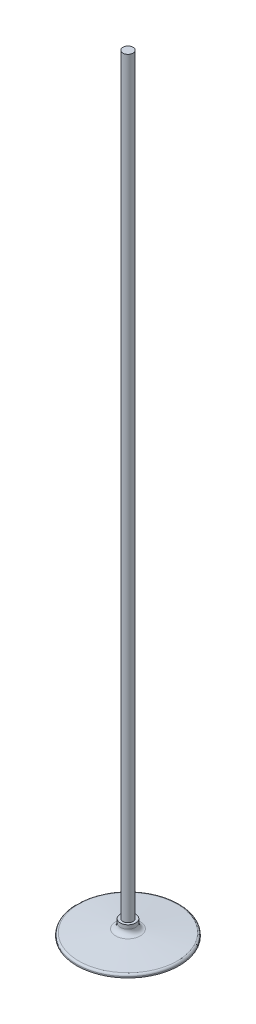
ISO-10303-21;
HEADER;
FILE_DESCRIPTION(('STEP AP214'),'2;1');
FILE_NAME('part.step','',(''),(''),'','','');
FILE_SCHEMA(('AUTOMOTIVE_DESIGN { 1 0 10303 214 1 1 1 1 }'));
ENDSEC;
DATA;
#1=APPLICATION_CONTEXT('core data for automotive mechanical design processes');
#2=APPLICATION_PROTOCOL_DEFINITION('international standard','automotive_design',2000,#1);
#3=PRODUCT_CONTEXT('',#1,'mechanical');
#4=PRODUCT('Part','Part','',(#3));
#5=PRODUCT_RELATED_PRODUCT_CATEGORY('part','',(#4));
#6=PRODUCT_DEFINITION_FORMATION('','',#4);
#7=PRODUCT_DEFINITION_CONTEXT('part definition',#1,'design');
#8=PRODUCT_DEFINITION('design','',#6,#7);
#9=PRODUCT_DEFINITION_SHAPE('','',#8);
#10=(LENGTH_UNIT() NAMED_UNIT(*) SI_UNIT(.MILLI.,.METRE.));
#11=(NAMED_UNIT(*) PLANE_ANGLE_UNIT() SI_UNIT($,.RADIAN.));
#12=(NAMED_UNIT(*) SI_UNIT($,.STERADIAN.) SOLID_ANGLE_UNIT());
#13=UNCERTAINTY_MEASURE_WITH_UNIT(LENGTH_MEASURE(1.E-05),#10,'distance_accuracy_value','');
#14=(GEOMETRIC_REPRESENTATION_CONTEXT(3) GLOBAL_UNCERTAINTY_ASSIGNED_CONTEXT((#13)) GLOBAL_UNIT_ASSIGNED_CONTEXT((#10,
#11,#12)) REPRESENTATION_CONTEXT('',''));
#15=CARTESIAN_POINT('',(0.,0.,0.));
#16=DIRECTION('',(0.,0.,1.));
#17=DIRECTION('',(1.,0.,0.));
#18=AXIS2_PLACEMENT_3D('',#15,#16,#17);
#19=CARTESIAN_POINT('',(0.,0.,0.));
#20=DIRECTION('',(0.,-1.,0.));
#21=DIRECTION('',(0.,0.,-1.));
#22=AXIS2_PLACEMENT_3D('',#19,#20,#21);
#23=PLANE('',#22);
#24=CARTESIAN_POINT('',(0.,0.,0.));
#25=DIRECTION('',(0.,1.,0.));
#26=DIRECTION('',(0.,0.,1.));
#27=AXIS2_PLACEMENT_3D('',#24,#25,#26);
#28=CIRCLE('',#27,100.);
#29=CARTESIAN_POINT('',(0.,0.,100.));
#30=VERTEX_POINT('',#29);
#31=EDGE_CURVE('E52',#30,#30,#28,.T.);
#32=ORIENTED_EDGE('',*,*,#31,.F.);
#33=EDGE_LOOP('',(#32));
#34=FACE_BOUND('',#33,.T.);
#35=ADVANCED_FACE('F32',(#34),#23,.T.);
#36=CARTESIAN_POINT('',(0.,0.,0.));
#37=DIRECTION('',(0.,1.,0.));
#38=DIRECTION('',(0.,0.,1.));
#39=AXIS2_PLACEMENT_3D('',#36,#37,#38);
#40=CYLINDRICAL_SURFACE('',#39,100.);
#41=CARTESIAN_POINT('',(0.,2.33467530393027,0.));
#42=DIRECTION('',(0.,-1.,0.));
#43=DIRECTION('',(0.,0.,-1.));
#44=AXIS2_PLACEMENT_3D('',#41,#42,#43);
#45=CIRCLE('',#44,100.);
#46=CARTESIAN_POINT('',(0.,2.33467530393027,-100.));
#47=VERTEX_POINT('',#46);
#48=EDGE_CURVE('E43',#47,#47,#45,.T.);
#49=ORIENTED_EDGE('',*,*,#48,.T.);
#50=EDGE_LOOP('',(#49));
#51=FACE_BOUND('',#50,.T.);
#52=ORIENTED_EDGE('',*,*,#31,.T.);
#53=EDGE_LOOP('',(#52));
#54=FACE_BOUND('',#53,.T.);
#55=ADVANCED_FACE('F82',(#51,#54),#40,.T.);
#56=CARTESIAN_POINT('',(0.,13.436536399703,0.));
#57=DIRECTION('',(0.,-1.,0.));
#58=DIRECTION('',(0.,0.,-1.));
#59=AXIS2_PLACEMENT_3D('',#56,#57,#58);
#60=CONICAL_SURFACE('',#59,15.,1.48352986419519);
#61=CARTESIAN_POINT('',(0.,12.6379011589597,0.));
#62=DIRECTION('',(0.,-1.,0.));
#63=DIRECTION('',(0.,0.,-1.));
#64=AXIS2_PLACEMENT_3D('',#61,#62,#63);
#65=CIRCLE('',#64,24.1284425725235);
#66=CARTESIAN_POINT('',(0.,12.6379011589597,-24.1284425725242));
#67=VERTEX_POINT('',#66);
#68=EDGE_CURVE('E10',#67,#67,#65,.T.);
#69=CARTESIAN_POINT('',(0.,6.31945409629725,0.));
#70=DIRECTION('',(0.,1.,0.));
#71=DIRECTION('',(0.,0.,1.));
#72=AXIS2_PLACEMENT_3D('',#69,#70,#71);
#73=CIRCLE('',#72,96.3486229709906);
#74=CARTESIAN_POINT('',(0.,6.31945409629725,-96.3486229709906));
#75=VERTEX_POINT('',#74);
#76=EDGE_CURVE('E47',#75,#75,#73,.T.);
#77=CARTESIAN_POINT('',(0.,12.6379011589597,-24.1284425725242));
#78=CARTESIAN_POINT('',(0.,12.572084002057,-24.8807361183415));
#79=CARTESIAN_POINT('',(0.,12.5062668451543,-25.6330296641589));
#80=CARTESIAN_POINT('',(0.,12.3746325313488,-27.1376167557936));
#81=CARTESIAN_POINT('',(0.,12.3088153744461,-27.889910301611));
#82=CARTESIAN_POINT('',(0.,12.1771810606406,-29.3944973932457));
#83=CARTESIAN_POINT('',(0.,12.1113639037379,-30.1467909390631));
#84=CARTESIAN_POINT('',(0.,11.9797295899324,-31.6513780306978));
#85=CARTESIAN_POINT('',(0.,11.9139124330297,-32.4036715765151));
#86=CARTESIAN_POINT('',(0.,11.7822781192242,-33.9082586681498));
#87=CARTESIAN_POINT('',(0.,11.7164609623215,-34.6605522139672));
#88=CARTESIAN_POINT('',(0.,11.584826648516,-36.1651393056019));
#89=CARTESIAN_POINT('',(0.,11.5190094916133,-36.9174328514193));
#90=CARTESIAN_POINT('',(0.,11.3873751778078,-38.422019943054));
#91=CARTESIAN_POINT('',(0.,11.3215580209051,-39.1743134888714));
#92=CARTESIAN_POINT('',(0.,11.1899237070996,-40.6789005805061));
#93=CARTESIAN_POINT('',(0.,11.1241065501969,-41.4311941263234));
#94=CARTESIAN_POINT('',(0.,10.9924722363914,-42.9357812179582));
#95=CARTESIAN_POINT('',(0.,10.9266550794886,-43.6880747637755));
#96=CARTESIAN_POINT('',(0.,10.7950207656832,-45.1926618554102));
#97=CARTESIAN_POINT('',(0.,10.7292036087805,-45.9449554012276));
#98=CARTESIAN_POINT('',(0.,10.597569294975,-47.4495424928623));
#99=CARTESIAN_POINT('',(0.,10.5317521380722,-48.2018360386797));
#100=CARTESIAN_POINT('',(0.,10.4001178242668,-49.7064231303144));
#101=CARTESIAN_POINT('',(0.,10.334300667364,-50.4587166761317));
#102=CARTESIAN_POINT('',(0.,10.2026663535586,-51.9633037677665));
#103=CARTESIAN_POINT('',(0.,10.1368491966558,-52.7155973135838));
#104=CARTESIAN_POINT('',(0.,10.0052148828504,-54.2201844052185));
#105=CARTESIAN_POINT('',(0.,9.93939772594764,-54.9724779510359));
#106=CARTESIAN_POINT('',(0.,9.80776341214217,-56.4770650426706));
#107=CARTESIAN_POINT('',(0.,9.74194625523944,-57.229358588488));
#108=CARTESIAN_POINT('',(0.,9.61031194143396,-58.7339456801227));
#109=CARTESIAN_POINT('',(0.,9.54449478453123,-59.48623922594));
#110=CARTESIAN_POINT('',(0.,9.41286047072576,-60.9908263175748));
#111=CARTESIAN_POINT('',(0.,9.34704331382303,-61.7431198633921));
#112=CARTESIAN_POINT('',(0.,9.21540900001756,-63.2477069550268));
#113=CARTESIAN_POINT('',(0.,9.14959184311483,-64.0000005008442));
#114=CARTESIAN_POINT('',(0.,9.01795752930936,-65.5045875924789));
#115=CARTESIAN_POINT('',(0.,8.95214037240662,-66.2568811382963));
#116=CARTESIAN_POINT('',(0.,8.82050605860115,-67.761468229931));
#117=CARTESIAN_POINT('',(0.,8.75468890169842,-68.5137617757483));
#118=CARTESIAN_POINT('',(0.,8.62305458789295,-70.0183488673831));
#119=CARTESIAN_POINT('',(0.,8.55723743099022,-70.7706424132004));
#120=CARTESIAN_POINT('',(0.,8.42560311718475,-72.2752295048351));
#121=CARTESIAN_POINT('',(0.,8.35978596028201,-73.0275230506525));
#122=CARTESIAN_POINT('',(0.,8.22815164647655,-74.5321101422872));
#123=CARTESIAN_POINT('',(0.,8.16233448957381,-75.2844036881046));
#124=CARTESIAN_POINT('',(0.,8.03070017576834,-76.7889907797393));
#125=CARTESIAN_POINT('',(0.,7.96488301886561,-77.5412843255567));
#126=CARTESIAN_POINT('',(0.,7.83324870506014,-79.0458714171914));
#127=CARTESIAN_POINT('',(0.,7.76743154815741,-79.7981649630087));
#128=CARTESIAN_POINT('',(0.,7.63579723435194,-81.3027520546434));
#129=CARTESIAN_POINT('',(0.,7.5699800774492,-82.0550456004608));
#130=CARTESIAN_POINT('',(0.,7.43834576364373,-83.5596326920955));
#131=CARTESIAN_POINT('',(0.,7.372528606741,-84.3119262379129));
#132=CARTESIAN_POINT('',(0.,7.24089429293553,-85.8165133295476));
#133=CARTESIAN_POINT('',(0.,7.1750771360328,-86.568806875365));
#134=CARTESIAN_POINT('',(0.,7.04344282222733,-88.0733939669997));
#135=CARTESIAN_POINT('',(0.,6.97762566532459,-88.825687512817));
#136=CARTESIAN_POINT('',(0.,6.84599135151913,-90.3302746044518));
#137=CARTESIAN_POINT('',(0.,6.78017419461639,-91.0825681502691));
#138=CARTESIAN_POINT('',(0.,6.64853988081092,-92.5871552419038));
#139=CARTESIAN_POINT('',(0.,6.58272272390819,-93.3394487877212));
#140=CARTESIAN_POINT('',(0.,6.45108841010272,-94.8440358793559));
#141=CARTESIAN_POINT('',(0.,6.38527125319999,-95.5963294251733));
#142=CARTESIAN_POINT('',(0.,6.31945409629725,-96.3486229709906));
#143=B_SPLINE_CURVE_WITH_KNOTS('',3,(#77,#78,#79,#80,#81,#82,#83,#84,#85,#86,#87,#88,#89,#90,
#91,#92,#93,#94,#95,#96,#97,#98,#99,#100,#101,#102,#103,#104,#105,#106,#107,#108,#109,#110,#111,
#112,#113,#114,#115,#116,#117,#118,#119,#120,#121,#122,#123,#124,#125,#126,#127,#128,#129,#130,
#131,#132,#133,#134,#135,#136,#137,#138,#139,#140,#141,#142),.UNSPECIFIED.,.F.,.F.,(4,2,2,2,2,2,
2,2,2,2,2,2,2,2,2,2,2,2,2,2,2,2,2,2,2,2,2,2,2,2,2,2,4),(0.,2.26550155484187,4.53100310968374,
6.7965046645256,9.06200621936747,11.3275077742093,13.5930093290512,15.8585108838931,
18.1240124387349,20.3895139935768,22.6550155484187,24.9205171032605,27.1860186581024,
29.4515202129443,31.7170217677862,33.982523322628,36.2480248774699,38.5135264323118,
40.7790279871536,43.0445295419955,45.3100310968374,47.5755326516792,49.8410342065211,
52.106535761363,54.3720373162048,56.6375388710467,58.9030404258885,61.1685419807304,
63.4340435355723,65.6995450904141,67.965046645256,70.2305482000979,72.4960497549398),.UNSPECIFIED.);
#144=EDGE_CURVE('BSEAM88',#67,#75,#143,.T.);
#145=ORIENTED_EDGE('',*,*,#68,.T.);
#146=ORIENTED_EDGE('',*,*,#76,.T.);
#147=ORIENTED_EDGE('',*,*,#144,.T.);
#148=ORIENTED_EDGE('',*,*,#144,.F.);
#149=EDGE_LOOP('',(#145,#147,#146,#148));
#150=FACE_BOUND('',#149,.T.);
#151=ADVANCED_FACE('F88',(#150),#60,.T.);
#152=CARTESIAN_POINT('',(0.,0.,0.));
#153=DIRECTION('',(0.,1.,0.));
#154=DIRECTION('',(0.,0.,1.));
#155=AXIS2_PLACEMENT_3D('',#152,#153,#154);
#156=CYLINDRICAL_SURFACE('',#155,15.);
#157=CARTESIAN_POINT('',(0.,22.5998481398773,0.));
#158=DIRECTION('',(0.,1.,0.));
#159=DIRECTION('',(0.,0.,1.));
#160=AXIS2_PLACEMENT_3D('',#157,#158,#159);
#161=CIRCLE('',#160,15.);
#162=CARTESIAN_POINT('',(0.,22.5998481398773,15.));
#163=VERTEX_POINT('',#162);
#164=EDGE_CURVE('E39',#163,#163,#161,.T.);
#165=ORIENTED_EDGE('',*,*,#164,.T.);
#166=EDGE_LOOP('',(#165));
#167=FACE_BOUND('',#166,.T.);
#168=CARTESIAN_POINT('',(0.,30.,0.));
#169=DIRECTION('',(0.,1.,0.));
#170=DIRECTION('',(0.,0.,1.));
#171=AXIS2_PLACEMENT_3D('',#168,#169,#170);
#172=CIRCLE('',#171,15.);
#173=CARTESIAN_POINT('',(0.,30.,15.));
#174=VERTEX_POINT('',#173);
#175=EDGE_CURVE('E55',#174,#174,#172,.T.);
#176=ORIENTED_EDGE('',*,*,#175,.F.);
#177=EDGE_LOOP('',(#176));
#178=FACE_BOUND('',#177,.T.);
#179=ADVANCED_FACE('F78',(#167,#178),#156,.T.);
#180=CARTESIAN_POINT('',(-15.,30.,0.));
#181=DIRECTION('',(0.,1.,0.));
#182=DIRECTION('',(0.,0.,1.));
#183=AXIS2_PLACEMENT_3D('',#180,#181,#182);
#184=PLANE('',#183);
#185=ORIENTED_EDGE('',*,*,#175,.T.);
#186=EDGE_LOOP('',(#185));
#187=FACE_BOUND('',#186,.T.);
#188=CARTESIAN_POINT('',(0.,30.,0.));
#189=DIRECTION('',(0.,1.,0.));
#190=DIRECTION('',(0.,0.,1.));
#191=AXIS2_PLACEMENT_3D('',#188,#189,#190);
#192=CIRCLE('',#191,10.);
#193=CARTESIAN_POINT('',(0.,30.,10.));
#194=VERTEX_POINT('',#193);
#195=EDGE_CURVE('E58',#194,#194,#192,.T.);
#196=ORIENTED_EDGE('',*,*,#195,.F.);
#197=EDGE_LOOP('',(#196));
#198=FACE_BOUND('',#197,.T.);
#199=ADVANCED_FACE('F69',(#187,#198),#184,.T.);
#200=CARTESIAN_POINT('',(0.,0.,0.));
#201=DIRECTION('',(0.,1.,0.));
#202=DIRECTION('',(0.,0.,1.));
#203=AXIS2_PLACEMENT_3D('',#200,#201,#202);
#204=CYLINDRICAL_SURFACE('',#203,10.);
#205=ORIENTED_EDGE('',*,*,#195,.T.);
#206=EDGE_LOOP('',(#205));
#207=FACE_BOUND('',#206,.T.);
#208=CARTESIAN_POINT('',(0.,1500.,0.));
#209=DIRECTION('',(0.,1.,0.));
#210=DIRECTION('',(0.,0.,1.));
#211=AXIS2_PLACEMENT_3D('',#208,#209,#210);
#212=CIRCLE('',#211,10.);
#213=CARTESIAN_POINT('',(0.,1500.,10.));
#214=VERTEX_POINT('',#213);
#215=EDGE_CURVE('E61',#214,#214,#212,.T.);
#216=ORIENTED_EDGE('',*,*,#215,.F.);
#217=EDGE_LOOP('',(#216));
#218=FACE_BOUND('',#217,.T.);
#219=ADVANCED_FACE('F67',(#207,#218),#204,.T.);
#220=CARTESIAN_POINT('',(-10.,1500.,0.));
#221=DIRECTION('',(0.,1.,0.));
#222=DIRECTION('',(0.,0.,1.));
#223=AXIS2_PLACEMENT_3D('',#220,#221,#222);
#224=PLANE('',#223);
#225=ORIENTED_EDGE('',*,*,#215,.T.);
#226=EDGE_LOOP('',(#225));
#227=FACE_BOUND('',#226,.T.);
#228=ADVANCED_FACE('F65',(#227),#224,.T.);
#229=CARTESIAN_POINT('',(0.,2.33467530393027,0.));
#230=DIRECTION('',(0.,-1.,0.));
#231=DIRECTION('',(0.,0.,-1.));
#232=AXIS2_PLACEMENT_3D('',#229,#230,#231);
#233=TOROIDAL_SURFACE('',#232,96.,4.);
#234=ORIENTED_EDGE('',*,*,#48,.F.);
#235=EDGE_LOOP('',(#234));
#236=FACE_BOUND('',#235,.T.);
#237=ORIENTED_EDGE('',*,*,#76,.F.);
#238=EDGE_LOOP('',(#237));
#239=FACE_BOUND('',#238,.T.);
#240=ADVANCED_FACE('F76',(#236,#239),#233,.T.);
#241=CARTESIAN_POINT('',(0.,22.5998481398773,0.));
#242=DIRECTION('',(0.,1.,0.));
#243=DIRECTION('',(0.,0.,1.));
#244=AXIS2_PLACEMENT_3D('',#241,#242,#243);
#245=TOROIDAL_SURFACE('',#244,25.,10.);
#246=ORIENTED_EDGE('',*,*,#68,.F.);
#247=EDGE_LOOP('',(#246));
#248=FACE_BOUND('',#247,.T.);
#249=ORIENTED_EDGE('',*,*,#164,.F.);
#250=EDGE_LOOP('',(#249));
#251=FACE_BOUND('',#250,.T.);
#252=ADVANCED_FACE('F34',(#248,#251),#245,.F.);
#253=CLOSED_SHELL('',(#35,#55,#151,#179,#199,#219,#228,#240,#252));
#254=MANIFOLD_SOLID_BREP('B2',#253);
#255=ADVANCED_BREP_SHAPE_REPRESENTATION('',(#18,#254),#14);
#256=SHAPE_DEFINITION_REPRESENTATION(#9,#255);
ENDSEC;
END-ISO-10303-21;
